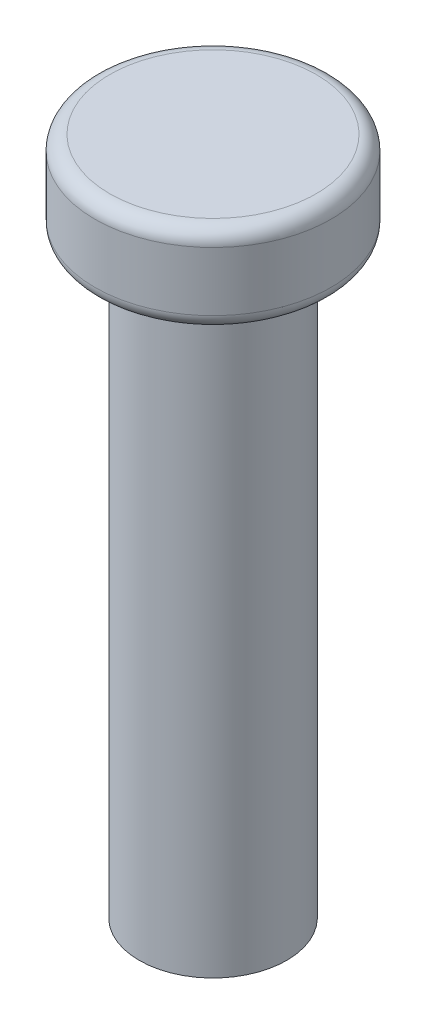
ISO-10303-21;
HEADER;
FILE_DESCRIPTION(('STEP AP214'),'2;1');
FILE_NAME('part.step','',(''),(''),'','','');
FILE_SCHEMA(('AUTOMOTIVE_DESIGN { 1 0 10303 214 1 1 1 1 }'));
ENDSEC;
DATA;
#1=APPLICATION_CONTEXT('core data for automotive mechanical design processes');
#2=APPLICATION_PROTOCOL_DEFINITION('international standard','automotive_design',2000,#1);
#3=PRODUCT_CONTEXT('',#1,'mechanical');
#4=PRODUCT('Part','Part','',(#3));
#5=PRODUCT_RELATED_PRODUCT_CATEGORY('part','',(#4));
#6=PRODUCT_DEFINITION_FORMATION('','',#4);
#7=PRODUCT_DEFINITION_CONTEXT('part definition',#1,'design');
#8=PRODUCT_DEFINITION('design','',#6,#7);
#9=PRODUCT_DEFINITION_SHAPE('','',#8);
#10=(LENGTH_UNIT() NAMED_UNIT(*) SI_UNIT(.MILLI.,.METRE.));
#11=(NAMED_UNIT(*) PLANE_ANGLE_UNIT() SI_UNIT($,.RADIAN.));
#12=(NAMED_UNIT(*) SI_UNIT($,.STERADIAN.) SOLID_ANGLE_UNIT());
#13=UNCERTAINTY_MEASURE_WITH_UNIT(LENGTH_MEASURE(1.E-05),#10,'distance_accuracy_value','');
#14=(GEOMETRIC_REPRESENTATION_CONTEXT(3) GLOBAL_UNCERTAINTY_ASSIGNED_CONTEXT((#13)) GLOBAL_UNIT_ASSIGNED_CONTEXT((#10,
#11,#12)) REPRESENTATION_CONTEXT('',''));
#15=CARTESIAN_POINT('',(0.,0.,0.));
#16=DIRECTION('',(0.,0.,1.));
#17=DIRECTION('',(1.,0.,0.));
#18=AXIS2_PLACEMENT_3D('',#15,#16,#17);
#19=CARTESIAN_POINT('',(0.,20.,0.));
#20=DIRECTION('',(0.,-1.,0.));
#21=DIRECTION('',(0.,0.,-1.));
#22=AXIS2_PLACEMENT_3D('',#19,#20,#21);
#23=CYLINDRICAL_SURFACE('',#22,2.5);
#24=CARTESIAN_POINT('',(0.,20.,0.));
#25=DIRECTION('',(0.,1.,0.));
#26=DIRECTION('',(0.,0.,1.));
#27=AXIS2_PLACEMENT_3D('',#24,#25,#26);
#28=CIRCLE('',#27,2.5);
#29=CARTESIAN_POINT('',(0.,20.,2.5));
#30=VERTEX_POINT('',#29);
#31=EDGE_CURVE('E51',#30,#30,#28,.T.);
#32=ORIENTED_EDGE('',*,*,#31,.F.);
#33=EDGE_LOOP('',(#32));
#34=FACE_BOUND('',#33,.T.);
#35=CARTESIAN_POINT('',(0.,0.,0.));
#36=DIRECTION('',(0.,1.,0.));
#37=DIRECTION('',(0.,0.,1.));
#38=AXIS2_PLACEMENT_3D('',#35,#36,#37);
#39=CIRCLE('',#38,2.5);
#40=CARTESIAN_POINT('',(0.,0.,2.5));
#41=VERTEX_POINT('',#40);
#42=EDGE_CURVE('E52',#41,#41,#39,.T.);
#43=ORIENTED_EDGE('',*,*,#42,.T.);
#44=EDGE_LOOP('',(#43));
#45=FACE_BOUND('',#44,.T.);
#46=ADVANCED_FACE('F31',(#34,#45),#23,.T.);
#47=CARTESIAN_POINT('',(0.,0.,0.));
#48=DIRECTION('',(0.,1.,0.));
#49=DIRECTION('',(0.,0.,1.));
#50=AXIS2_PLACEMENT_3D('',#47,#48,#49);
#51=PLANE('',#50);
#52=ORIENTED_EDGE('',*,*,#42,.F.);
#53=EDGE_LOOP('',(#52));
#54=FACE_BOUND('',#53,.T.);
#55=ADVANCED_FACE('F62',(#54),#51,.F.);
#56=CARTESIAN_POINT('',(0.,23.,0.));
#57=DIRECTION('',(0.,-1.,0.));
#58=DIRECTION('',(0.,0.,-1.));
#59=AXIS2_PLACEMENT_3D('',#56,#57,#58);
#60=CYLINDRICAL_SURFACE('',#59,4.);
#61=CARTESIAN_POINT('',(0.,20.5,0.));
#62=DIRECTION('',(0.,1.,0.));
#63=DIRECTION('',(0.,0.,1.));
#64=AXIS2_PLACEMENT_3D('',#61,#62,#63);
#65=CIRCLE('',#64,4.);
#66=CARTESIAN_POINT('',(0.,20.5,4.));
#67=VERTEX_POINT('',#66);
#68=EDGE_CURVE('E38',#67,#67,#65,.T.);
#69=ORIENTED_EDGE('',*,*,#68,.T.);
#70=EDGE_LOOP('',(#69));
#71=FACE_BOUND('',#70,.T.);
#72=CARTESIAN_POINT('',(0.,22.5,0.));
#73=DIRECTION('',(0.,1.,0.));
#74=DIRECTION('',(0.,0.,1.));
#75=AXIS2_PLACEMENT_3D('',#72,#73,#74);
#76=CIRCLE('',#75,4.);
#77=CARTESIAN_POINT('',(0.,22.5,4.));
#78=VERTEX_POINT('',#77);
#79=EDGE_CURVE('E42',#78,#78,#76,.F.);
#80=ORIENTED_EDGE('',*,*,#79,.T.);
#81=EDGE_LOOP('',(#80));
#82=FACE_BOUND('',#81,.T.);
#83=ADVANCED_FACE('F67',(#71,#82),#60,.T.);
#84=CARTESIAN_POINT('',(0.,23.,0.));
#85=DIRECTION('',(0.,1.,0.));
#86=DIRECTION('',(0.,0.,1.));
#87=AXIS2_PLACEMENT_3D('',#84,#85,#86);
#88=PLANE('',#87);
#89=CARTESIAN_POINT('',(0.,23.,0.));
#90=DIRECTION('',(0.,1.,0.));
#91=DIRECTION('',(0.,0.,1.));
#92=AXIS2_PLACEMENT_3D('',#89,#90,#91);
#93=CIRCLE('',#92,3.5);
#94=CARTESIAN_POINT('',(0.,23.,3.5));
#95=VERTEX_POINT('',#94);
#96=EDGE_CURVE('E46',#95,#95,#93,.T.);
#97=ORIENTED_EDGE('',*,*,#96,.T.);
#98=EDGE_LOOP('',(#97));
#99=FACE_BOUND('',#98,.T.);
#100=ADVANCED_FACE('F72',(#99),#88,.T.);
#101=CARTESIAN_POINT('',(0.,20.,0.));
#102=DIRECTION('',(0.,1.,0.));
#103=DIRECTION('',(0.,0.,1.));
#104=AXIS2_PLACEMENT_3D('',#101,#102,#103);
#105=PLANE('',#104);
#106=CARTESIAN_POINT('',(0.,20.,0.));
#107=DIRECTION('',(0.,1.,0.));
#108=DIRECTION('',(0.,0.,1.));
#109=AXIS2_PLACEMENT_3D('',#106,#107,#108);
#110=CIRCLE('',#109,3.5);
#111=CARTESIAN_POINT('',(0.,20.,3.5));
#112=VERTEX_POINT('',#111);
#113=EDGE_CURVE('E10',#112,#112,#110,.F.);
#114=ORIENTED_EDGE('',*,*,#113,.T.);
#115=EDGE_LOOP('',(#114));
#116=FACE_BOUND('',#115,.T.);
#117=ORIENTED_EDGE('',*,*,#31,.T.);
#118=EDGE_LOOP('',(#117));
#119=FACE_BOUND('',#118,.T.);
#120=ADVANCED_FACE('F58',(#116,#119),#105,.F.);
#121=CARTESIAN_POINT('',(0.,22.5,0.));
#122=DIRECTION('',(0.,1.,0.));
#123=DIRECTION('',(0.,0.,1.));
#124=AXIS2_PLACEMENT_3D('',#121,#122,#123);
#125=TOROIDAL_SURFACE('',#124,3.5,0.5);
#126=ORIENTED_EDGE('',*,*,#79,.F.);
#127=EDGE_LOOP('',(#126));
#128=FACE_BOUND('',#127,.T.);
#129=ORIENTED_EDGE('',*,*,#96,.F.);
#130=EDGE_LOOP('',(#129));
#131=FACE_BOUND('',#130,.T.);
#132=ADVANCED_FACE('F75',(#128,#131),#125,.T.);
#133=CARTESIAN_POINT('',(0.,20.5,0.));
#134=DIRECTION('',(0.,1.,0.));
#135=DIRECTION('',(0.,0.,1.));
#136=AXIS2_PLACEMENT_3D('',#133,#134,#135);
#137=TOROIDAL_SURFACE('',#136,3.5,0.5);
#138=ORIENTED_EDGE('',*,*,#113,.F.);
#139=EDGE_LOOP('',(#138));
#140=FACE_BOUND('',#139,.T.);
#141=ORIENTED_EDGE('',*,*,#68,.F.);
#142=EDGE_LOOP('',(#141));
#143=FACE_BOUND('',#142,.T.);
#144=ADVANCED_FACE('F33',(#140,#143),#137,.T.);
#145=CLOSED_SHELL('',(#46,#55,#83,#100,#120,#132,#144));
#146=MANIFOLD_SOLID_BREP('B2',#145);
#147=ADVANCED_BREP_SHAPE_REPRESENTATION('',(#18,#146),#14);
#148=SHAPE_DEFINITION_REPRESENTATION(#9,#147);
ENDSEC;
END-ISO-10303-21;
